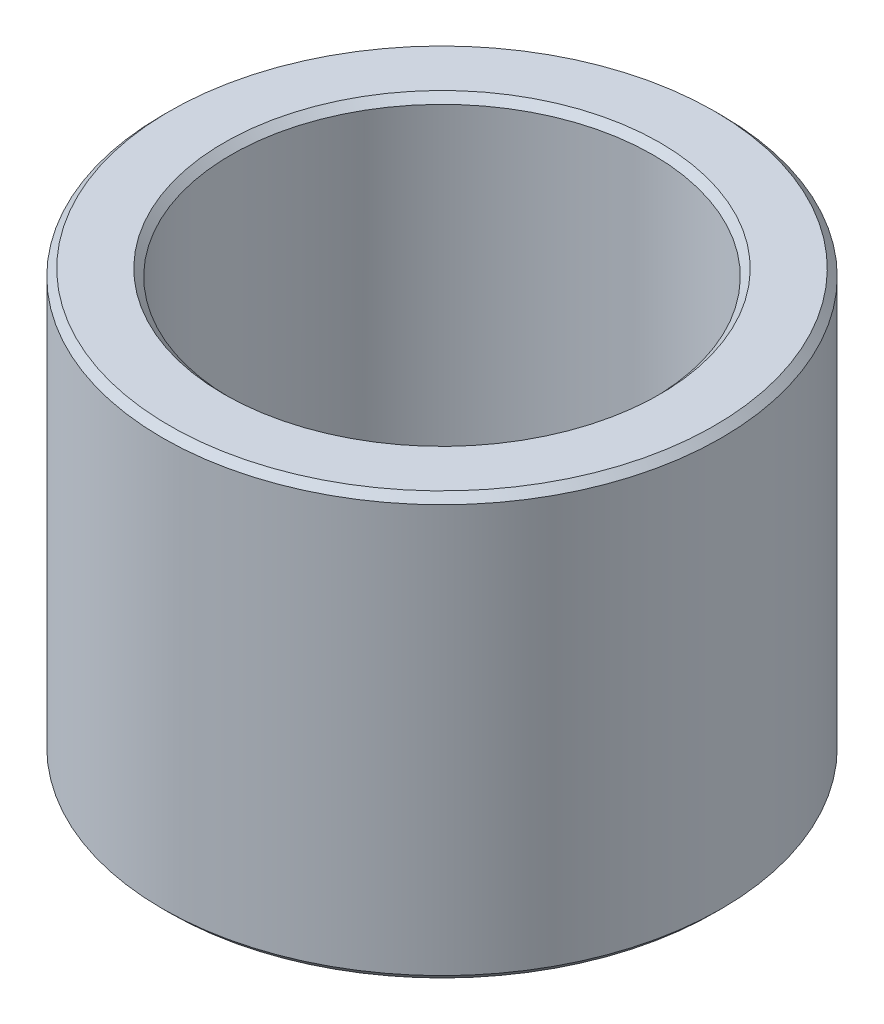
ISO-10303-21;
HEADER;
FILE_DESCRIPTION(('STEP AP214'),'2;1');
FILE_NAME('part.step','',(''),(''),'','','');
FILE_SCHEMA(('AUTOMOTIVE_DESIGN { 1 0 10303 214 1 1 1 1 }'));
ENDSEC;
DATA;
#1=APPLICATION_CONTEXT('core data for automotive mechanical design processes');
#2=APPLICATION_PROTOCOL_DEFINITION('international standard','automotive_design',2000,#1);
#3=PRODUCT_CONTEXT('',#1,'mechanical');
#4=PRODUCT('Part','Part','',(#3));
#5=PRODUCT_RELATED_PRODUCT_CATEGORY('part','',(#4));
#6=PRODUCT_DEFINITION_FORMATION('','',#4);
#7=PRODUCT_DEFINITION_CONTEXT('part definition',#1,'design');
#8=PRODUCT_DEFINITION('design','',#6,#7);
#9=PRODUCT_DEFINITION_SHAPE('','',#8);
#10=(LENGTH_UNIT() NAMED_UNIT(*) SI_UNIT(.MILLI.,.METRE.));
#11=(NAMED_UNIT(*) PLANE_ANGLE_UNIT() SI_UNIT($,.RADIAN.));
#12=(NAMED_UNIT(*) SI_UNIT($,.STERADIAN.) SOLID_ANGLE_UNIT());
#13=UNCERTAINTY_MEASURE_WITH_UNIT(LENGTH_MEASURE(1.E-05),#10,'distance_accuracy_value','');
#14=(GEOMETRIC_REPRESENTATION_CONTEXT(3) GLOBAL_UNCERTAINTY_ASSIGNED_CONTEXT((#13)) GLOBAL_UNIT_ASSIGNED_CONTEXT((#10,
#11,#12)) REPRESENTATION_CONTEXT('',''));
#15=CARTESIAN_POINT('',(0.,0.,0.));
#16=DIRECTION('',(0.,0.,1.));
#17=DIRECTION('',(1.,0.,0.));
#18=AXIS2_PLACEMENT_3D('',#15,#16,#17);
#19=CARTESIAN_POINT('',(0.,3.,0.));
#20=DIRECTION('',(0.,-1.,0.));
#21=DIRECTION('',(0.,0.,-1.));
#22=AXIS2_PLACEMENT_3D('',#19,#20,#21);
#23=CYLINDRICAL_SURFACE('',#22,3.);
#24=CARTESIAN_POINT('',(0.,-2.89999999989732,0.));
#25=DIRECTION('',(0.,-1.,0.));
#26=DIRECTION('',(0.,0.,-1.));
#27=AXIS2_PLACEMENT_3D('',#24,#25,#26);
#28=CIRCLE('',#27,2.9999999999859);
#29=CARTESIAN_POINT('',(0.,-2.89999999989732,-2.9999999999859));
#30=VERTEX_POINT('',#29);
#31=EDGE_CURVE('E30',#30,#30,#28,.T.);
#32=ORIENTED_EDGE('',*,*,#31,.T.);
#33=EDGE_LOOP('',(#32));
#34=FACE_BOUND('',#33,.T.);
#35=CARTESIAN_POINT('',(0.,2.89999999995416,0.));
#36=DIRECTION('',(0.,1.,0.));
#37=DIRECTION('',(0.,0.,1.));
#38=AXIS2_PLACEMENT_3D('',#35,#36,#37);
#39=CIRCLE('',#38,2.9999999999859);
#40=CARTESIAN_POINT('',(0.,2.89999999995416,2.9999999999859));
#41=VERTEX_POINT('',#40);
#42=EDGE_CURVE('E33',#41,#41,#39,.T.);
#43=ORIENTED_EDGE('',*,*,#42,.T.);
#44=EDGE_LOOP('',(#43));
#45=FACE_BOUND('',#44,.T.);
#46=ADVANCED_FACE('F15',(#34,#45),#23,.F.);
#47=CARTESIAN_POINT('',(0.,2.9999999999859,0.));
#48=DIRECTION('',(0.,1.,0.));
#49=DIRECTION('',(0.,0.,1.));
#50=AXIS2_PLACEMENT_3D('',#47,#48,#49);
#51=CONICAL_SURFACE('',#50,3.10000000001764,0.785398163397448);
#52=ORIENTED_EDGE('',*,*,#42,.F.);
#53=EDGE_LOOP('',(#52));
#54=FACE_BOUND('',#53,.T.);
#55=CARTESIAN_POINT('',(0.,2.9999999999859,0.));
#56=DIRECTION('',(0.,1.,0.));
#57=DIRECTION('',(0.,0.,1.));
#58=AXIS2_PLACEMENT_3D('',#55,#56,#57);
#59=CIRCLE('',#58,3.10000000001764);
#60=CARTESIAN_POINT('',(0.,2.9999999999859,3.10000000001764));
#61=VERTEX_POINT('',#60);
#62=EDGE_CURVE('E18',#61,#61,#59,.F.);
#63=ORIENTED_EDGE('',*,*,#62,.F.);
#64=EDGE_LOOP('',(#63));
#65=FACE_BOUND('',#64,.T.);
#66=ADVANCED_FACE('F50',(#54,#65),#51,.F.);
#67=CARTESIAN_POINT('',(0.,-2.99999999992906,0.));
#68=DIRECTION('',(0.,-1.,0.));
#69=DIRECTION('',(0.,0.,-1.));
#70=AXIS2_PLACEMENT_3D('',#67,#68,#69);
#71=CONICAL_SURFACE('',#70,3.10000000001764,0.785398163397448);
#72=CARTESIAN_POINT('',(0.,-2.99999999992906,0.));
#73=DIRECTION('',(0.,-1.,0.));
#74=DIRECTION('',(0.,0.,-1.));
#75=AXIS2_PLACEMENT_3D('',#72,#73,#74);
#76=CIRCLE('',#75,3.10000000001764);
#77=CARTESIAN_POINT('',(0.,-2.99999999992906,-3.10000000001764));
#78=VERTEX_POINT('',#77);
#79=EDGE_CURVE('E40',#78,#78,#76,.T.);
#80=ORIENTED_EDGE('',*,*,#79,.T.);
#81=EDGE_LOOP('',(#80));
#82=FACE_BOUND('',#81,.T.);
#83=ORIENTED_EDGE('',*,*,#31,.F.);
#84=EDGE_LOOP('',(#83));
#85=FACE_BOUND('',#84,.T.);
#86=ADVANCED_FACE('F52',(#82,#85),#71,.F.);
#87=CARTESIAN_POINT('',(0.,3.,0.));
#88=DIRECTION('',(0.,1.,0.));
#89=DIRECTION('',(0.,0.,1.));
#90=AXIS2_PLACEMENT_3D('',#87,#88,#89);
#91=PLANE('',#90);
#92=ORIENTED_EDGE('',*,*,#62,.T.);
#93=EDGE_LOOP('',(#92));
#94=FACE_BOUND('',#93,.T.);
#95=CARTESIAN_POINT('',(0.,2.9999999999859,0.));
#96=DIRECTION('',(0.,-1.,0.));
#97=DIRECTION('',(0.,0.,-1.));
#98=AXIS2_PLACEMENT_3D('',#95,#96,#97);
#99=CIRCLE('',#98,3.87499999999363);
#100=CARTESIAN_POINT('',(0.,2.9999999999859,-3.87499999999363));
#101=VERTEX_POINT('',#100);
#102=EDGE_CURVE('E38',#101,#101,#99,.T.);
#103=ORIENTED_EDGE('',*,*,#102,.F.);
#104=EDGE_LOOP('',(#103));
#105=FACE_BOUND('',#104,.T.);
#106=ADVANCED_FACE('F47',(#94,#105),#91,.T.);
#107=CARTESIAN_POINT('',(0.,-3.,0.));
#108=DIRECTION('',(0.,1.,0.));
#109=DIRECTION('',(0.,0.,1.));
#110=AXIS2_PLACEMENT_3D('',#107,#108,#109);
#111=PLANE('',#110);
#112=ORIENTED_EDGE('',*,*,#79,.F.);
#113=EDGE_LOOP('',(#112));
#114=FACE_BOUND('',#113,.T.);
#115=CARTESIAN_POINT('',(0.,-2.9999999999859,0.));
#116=DIRECTION('',(0.,1.,0.));
#117=DIRECTION('',(0.,0.,1.));
#118=AXIS2_PLACEMENT_3D('',#115,#116,#117);
#119=CIRCLE('',#118,3.87499999999363);
#120=CARTESIAN_POINT('',(0.,-2.9999999999859,3.87499999999363));
#121=VERTEX_POINT('',#120);
#122=EDGE_CURVE('E27',#121,#121,#119,.T.);
#123=ORIENTED_EDGE('',*,*,#122,.F.);
#124=EDGE_LOOP('',(#123));
#125=FACE_BOUND('',#124,.T.);
#126=ADVANCED_FACE('F76',(#114,#125),#111,.F.);
#127=CARTESIAN_POINT('',(0.,2.90000000006785,0.));
#128=DIRECTION('',(0.,-1.,0.));
#129=DIRECTION('',(0.,0.,-1.));
#130=AXIS2_PLACEMENT_3D('',#127,#128,#129);
#131=CONICAL_SURFACE('',#130,3.97499999991169,0.785398163397448);
#132=CARTESIAN_POINT('',(0.,2.9,0.));
#133=DIRECTION('',(0.,-1.,0.));
#134=DIRECTION('',(0.,0.,-1.));
#135=AXIS2_PLACEMENT_3D('',#132,#133,#134);
#136=CIRCLE('',#135,3.975);
#137=CARTESIAN_POINT('',(0.,2.9,-3.975));
#138=VERTEX_POINT('',#137);
#139=EDGE_CURVE('E22',#138,#138,#136,.T.);
#140=ORIENTED_EDGE('',*,*,#139,.F.);
#141=EDGE_LOOP('',(#140));
#142=FACE_BOUND('',#141,.T.);
#143=ORIENTED_EDGE('',*,*,#102,.T.);
#144=EDGE_LOOP('',(#143));
#145=FACE_BOUND('',#144,.T.);
#146=ADVANCED_FACE('F69',(#142,#145),#131,.T.);
#147=CARTESIAN_POINT('',(0.,-2.90000000006785,0.));
#148=DIRECTION('',(0.,1.,0.));
#149=DIRECTION('',(0.,0.,1.));
#150=AXIS2_PLACEMENT_3D('',#147,#148,#149);
#151=CONICAL_SURFACE('',#150,3.97499999996853,0.785398163681665);
#152=CARTESIAN_POINT('',(0.,-2.9,0.));
#153=DIRECTION('',(0.,-1.,0.));
#154=DIRECTION('',(0.,0.,-1.));
#155=AXIS2_PLACEMENT_3D('',#152,#153,#154);
#156=CIRCLE('',#155,3.975);
#157=CARTESIAN_POINT('',(0.,-2.9,-3.975));
#158=VERTEX_POINT('',#157);
#159=EDGE_CURVE('E10',#158,#158,#156,.F.);
#160=ORIENTED_EDGE('',*,*,#159,.F.);
#161=EDGE_LOOP('',(#160));
#162=FACE_BOUND('',#161,.T.);
#163=ORIENTED_EDGE('',*,*,#122,.T.);
#164=EDGE_LOOP('',(#163));
#165=FACE_BOUND('',#164,.T.);
#166=ADVANCED_FACE('F64',(#162,#165),#151,.T.);
#167=CARTESIAN_POINT('',(0.,3.,0.));
#168=DIRECTION('',(0.,-1.,0.));
#169=DIRECTION('',(0.,0.,-1.));
#170=AXIS2_PLACEMENT_3D('',#167,#168,#169);
#171=CYLINDRICAL_SURFACE('',#170,3.975);
#172=ORIENTED_EDGE('',*,*,#159,.T.);
#173=EDGE_LOOP('',(#172));
#174=FACE_BOUND('',#173,.T.);
#175=ORIENTED_EDGE('',*,*,#139,.T.);
#176=EDGE_LOOP('',(#175));
#177=FACE_BOUND('',#176,.T.);
#178=ADVANCED_FACE('F62',(#174,#177),#171,.T.);
#179=CLOSED_SHELL('',(#46,#66,#86,#106,#126,#146,#166,#178));
#180=MANIFOLD_SOLID_BREP('B1',#179);
#181=ADVANCED_BREP_SHAPE_REPRESENTATION('',(#18,#180),#14);
#182=SHAPE_DEFINITION_REPRESENTATION(#9,#181);
ENDSEC;
END-ISO-10303-21;
